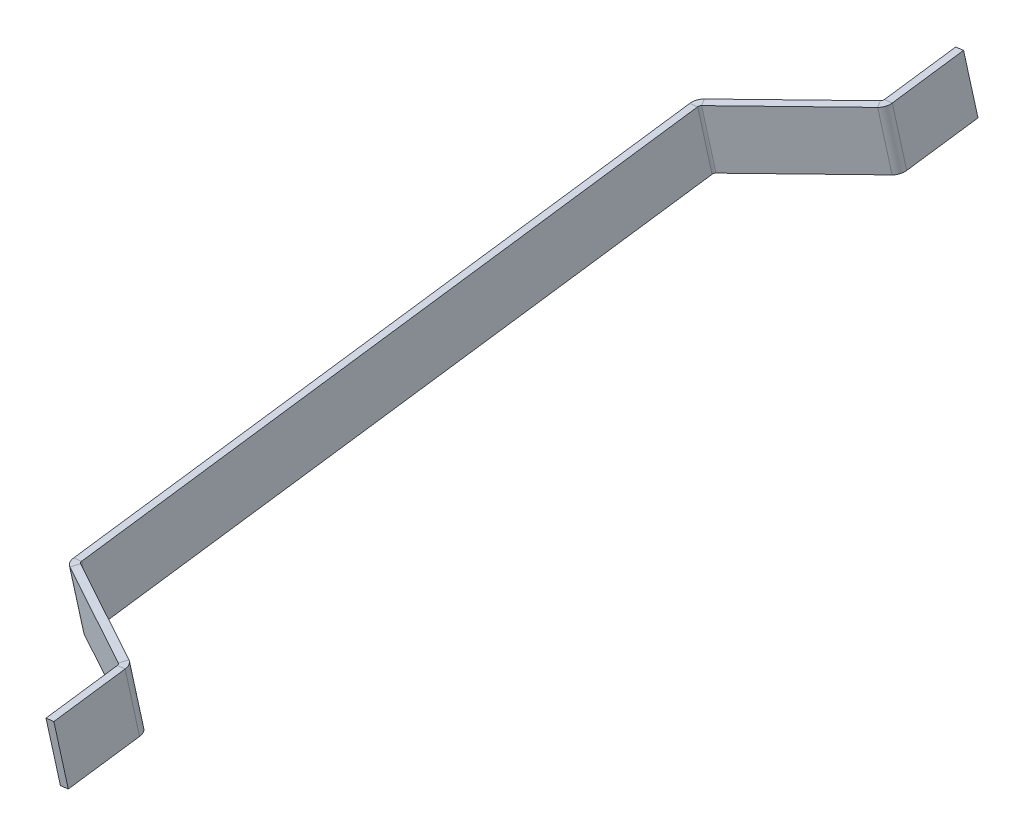
ISO-10303-21;
HEADER;
FILE_DESCRIPTION(('STEP AP214'),'2;1');
FILE_NAME('part.step','',(''),(''),'','','');
FILE_SCHEMA(('AUTOMOTIVE_DESIGN { 1 0 10303 214 1 1 1 1 }'));
ENDSEC;
DATA;
#1=APPLICATION_CONTEXT('core data for automotive mechanical design processes');
#2=APPLICATION_PROTOCOL_DEFINITION('international standard','automotive_design',2000,#1);
#3=PRODUCT_CONTEXT('',#1,'mechanical');
#4=PRODUCT('Part','Part','',(#3));
#5=PRODUCT_RELATED_PRODUCT_CATEGORY('part','',(#4));
#6=PRODUCT_DEFINITION_FORMATION('','',#4);
#7=PRODUCT_DEFINITION_CONTEXT('part definition',#1,'design');
#8=PRODUCT_DEFINITION('design','',#6,#7);
#9=PRODUCT_DEFINITION_SHAPE('','',#8);
#10=(LENGTH_UNIT() NAMED_UNIT(*) SI_UNIT(.MILLI.,.METRE.));
#11=(NAMED_UNIT(*) PLANE_ANGLE_UNIT() SI_UNIT($,.RADIAN.));
#12=(NAMED_UNIT(*) SI_UNIT($,.STERADIAN.) SOLID_ANGLE_UNIT());
#13=UNCERTAINTY_MEASURE_WITH_UNIT(LENGTH_MEASURE(1.E-05),#10,'distance_accuracy_value','');
#14=(GEOMETRIC_REPRESENTATION_CONTEXT(3) GLOBAL_UNCERTAINTY_ASSIGNED_CONTEXT((#13)) GLOBAL_UNIT_ASSIGNED_CONTEXT((#10,
#11,#12)) REPRESENTATION_CONTEXT('',''));
#15=CARTESIAN_POINT('',(0.,0.,0.));
#16=DIRECTION('',(0.,0.,1.));
#17=DIRECTION('',(1.,0.,0.));
#18=AXIS2_PLACEMENT_3D('',#15,#16,#17);
#19=CARTESIAN_POINT('',(82.6834600041197,-26.7837866283072,175.494995340924));
#20=DIRECTION('',(-0.120960947799844,0.985147863137996,0.121869343405159));
#21=DIRECTION('',(0.,-0.122770816771276,0.992435049033091));
#22=AXIS2_PLACEMENT_3D('',#19,#20,#21);
#23=PLANE('',#22);
#24=DIRECTION('',(0.483410747997688,0.165689925363093,-0.859570181749861));
#25=VECTOR('',#24,1.);
#26=CARTESIAN_POINT('',(82.3147471262454,-26.8029502008679,175.283942208965));
#27=LINE('',#26,#25);
#28=CARTESIAN_POINT('',(82.3147471262454,-26.8029502008679,175.283942208965));
#29=VERTEX_POINT('',#28);
#30=CARTESIAN_POINT('',(83.2815686222408,-26.4715703501417,173.564801845465));
#31=VERTEX_POINT('',#30);
#32=EDGE_CURVE('E235',#29,#31,#27,.T.);
#33=ORIENTED_EDGE('',*,*,#32,.F.);
#34=DIRECTION('',(0.866996250180865,0.0450614734314727,0.496273075820665));
#35=VECTOR('',#34,1.);
#36=CARTESIAN_POINT('',(82.6834600041197,-26.7837866283072,175.494995340924));
#37=LINE('',#36,#35);
#38=CARTESIAN_POINT('',(53.7084251625204,-28.2897421182166,158.909537606993));
#39=VERTEX_POINT('',#38);
#40=EDGE_CURVE('E250',#39,#29,#37,.T.);
#41=ORIENTED_EDGE('',*,*,#40,.F.);
#42=DIRECTION('',(-0.483410747997686,-0.165689925363088,0.859570181749863));
#43=VECTOR('',#42,1.);
#44=CARTESIAN_POINT('',(54.6752466585158,-27.9583622674904,157.190397243493));
#45=LINE('',#44,#43);
#46=CARTESIAN_POINT('',(54.6752466585158,-27.9583622674904,157.190397243493));
#47=VERTEX_POINT('',#46);
#48=EDGE_CURVE('E241',#47,#39,#45,.T.);
#49=ORIENTED_EDGE('',*,*,#48,.F.);
#50=DIRECTION('',(0.866996250180865,0.0450614734314727,0.496273075820665));
#51=VECTOR('',#50,1.);
#52=CARTESIAN_POINT('',(83.6502815001151,-26.452406777581,173.775854977424));
#53=LINE('',#52,#51);
#54=EDGE_CURVE('E249',#47,#31,#53,.T.);
#55=ORIENTED_EDGE('',*,*,#54,.T.);
#56=EDGE_LOOP('',(#33,#41,#49,#55));
#57=FACE_BOUND('',#56,.T.);
#58=ADVANCED_FACE('F39',(#57),#23,.F.);
#59=CARTESIAN_POINT('',(51.5252980676484,-13.5316877437073,160.526524626111));
#60=DIRECTION('',(0.120960947799844,-0.985147863137996,-0.121869343405159));
#61=DIRECTION('',(0.,0.122770816771276,-0.992435049033091));
#62=AXIS2_PLACEMENT_3D('',#59,#60,#61);
#63=PLANE('',#62);
#64=DIRECTION('',(0.483410747997681,0.165689925363098,-0.859570181749864));
#65=VECTOR('',#64,1.);
#66=CARTESIAN_POINT('',(80.5003329092477,-12.025732253798,177.111982360042));
#67=LINE('',#66,#65);
#68=CARTESIAN_POINT('',(80.5003329092477,-12.025732253798,177.111982360042));
#69=VERTEX_POINT('',#68);
#70=CARTESIAN_POINT('',(81.4671544052431,-11.6943524030718,175.392841996542));
#71=VERTEX_POINT('',#70);
#72=EDGE_CURVE('E228',#69,#71,#67,.T.);
#73=ORIENTED_EDGE('',*,*,#72,.T.);
#74=DIRECTION('',(-0.866996250180865,-0.0450614734314726,-0.496273075820664));
#75=VECTOR('',#74,1.);
#76=CARTESIAN_POINT('',(52.4921195636438,-13.2003078929812,158.807384262611));
#77=LINE('',#76,#75);
#78=CARTESIAN_POINT('',(52.8608324415181,-13.1811443204205,159.01843739457));
#79=VERTEX_POINT('',#78);
#80=EDGE_CURVE('E254',#71,#79,#77,.T.);
#81=ORIENTED_EDGE('',*,*,#80,.T.);
#82=DIRECTION('',(-0.483410747997686,-0.165689925363088,0.859570181749863));
#83=VECTOR('',#82,1.);
#84=CARTESIAN_POINT('',(52.8608324415181,-13.1811443204205,159.01843739457));
#85=LINE('',#84,#83);
#86=CARTESIAN_POINT('',(51.8940109455227,-13.5125241711467,160.73757775807));
#87=VERTEX_POINT('',#86);
#88=EDGE_CURVE('E237',#79,#87,#85,.T.);
#89=ORIENTED_EDGE('',*,*,#88,.T.);
#90=DIRECTION('',(-0.866996250180865,-0.0450614734314726,-0.496273075820664));
#91=VECTOR('',#90,1.);
#92=CARTESIAN_POINT('',(51.5252980676484,-13.5316877437073,160.526524626111));
#93=LINE('',#92,#91);
#94=EDGE_CURVE('E253',#69,#87,#93,.T.);
#95=ORIENTED_EDGE('',*,*,#94,.F.);
#96=EDGE_LOOP('',(#73,#81,#89,#95));
#97=FACE_BOUND('',#96,.T.);
#98=ADVANCED_FACE('F464',(#97),#63,.F.);
#99=CARTESIAN_POINT('',(-55.7459584144616,-19.1070300510368,99.1239102659929));
#100=DIRECTION('',(0.483410747997686,0.165689925363088,-0.859570181749863));
#101=DIRECTION('',(-0.871617770538203,0.,-0.490186150438803));
#102=AXIS2_PLACEMENT_3D('',#99,#100,#101);
#103=PLANE('',#102);
#104=DIRECTION('',(-0.120960947799848,0.985147863137994,0.121869343405168));
#105=VECTOR('',#104,1.);
#106=CARTESIAN_POINT('',(80.5003329092477,-12.025732253798,177.111982360042));
#107=LINE('',#106,#105);
#108=EDGE_CURVE('E232',#69,#29,#107,.F.);
#109=ORIENTED_EDGE('',*,*,#108,.F.);
#110=ORIENTED_EDGE('',*,*,#94,.T.);
#111=DIRECTION('',(-0.120960947799846,0.985147863137996,0.121869343405157));
#112=VECTOR('',#111,1.);
#113=CARTESIAN_POINT('',(51.8940109455227,-13.5125241711464,160.73757775807));
#114=LINE('',#113,#112);
#115=EDGE_CURVE('E244',#39,#87,#114,.T.);
#116=ORIENTED_EDGE('',*,*,#115,.F.);
#117=ORIENTED_EDGE('',*,*,#40,.T.);
#118=EDGE_LOOP('',(#109,#110,#116,#117));
#119=FACE_BOUND('',#118,.T.);
#120=ADVANCED_FACE('F470',(#119),#103,.F.);
#121=CARTESIAN_POINT('',(-54.7791369184663,-18.7756502003106,97.4047699024932));
#122=DIRECTION('',(0.483410747997686,0.165689925363088,-0.859570181749863));
#123=DIRECTION('',(-0.871617770538203,0.,-0.490186150438803));
#124=AXIS2_PLACEMENT_3D('',#121,#122,#123);
#125=PLANE('',#124);
#126=ORIENTED_EDGE('',*,*,#80,.F.);
#127=DIRECTION('',(-0.120960947799848,0.985147863137994,0.121869343405168));
#128=VECTOR('',#127,1.);
#129=CARTESIAN_POINT('',(81.4671544052431,-11.6943524030718,175.392841996542));
#130=LINE('',#129,#128);
#131=EDGE_CURVE('E183',#71,#31,#130,.F.);
#132=ORIENTED_EDGE('',*,*,#131,.T.);
#133=ORIENTED_EDGE('',*,*,#54,.F.);
#134=DIRECTION('',(0.120960947799846,-0.985147863137996,-0.121869343405157));
#135=VECTOR('',#134,1.);
#136=CARTESIAN_POINT('',(52.8608324415181,-13.1811443204205,159.01843739457));
#137=LINE('',#136,#135);
#138=EDGE_CURVE('E239',#79,#47,#137,.T.);
#139=ORIENTED_EDGE('',*,*,#138,.F.);
#140=EDGE_LOOP('',(#126,#132,#133,#139));
#141=FACE_BOUND('',#140,.T.);
#142=ADVANCED_FACE('F662',(#141),#125,.T.);
#143=CARTESIAN_POINT('',(50.1157776657231,6.15344375499394,0.));
#144=DIRECTION('',(-0.992546151641321,-0.121869343405158,0.));
#145=DIRECTION('',(0.121869343405158,-0.992546151641321,0.));
#146=AXIS2_PLACEMENT_3D('',#143,#144,#145);
#147=PLANE('',#146);
#148=DIRECTION('',(0.120960947799849,-0.985147863137995,-0.121869343405163));
#149=VECTOR('',#148,1.);
#150=CARTESIAN_POINT('',(54.3002175201919,-27.9260840268202,156.557237847616));
#151=LINE('',#150,#149);
#152=CARTESIAN_POINT('',(54.3002175201919,-27.9260840268202,156.557237847616));
#153=VERTEX_POINT('',#152);
#154=CARTESIAN_POINT('',(52.4858033031942,-13.1488660797503,158.385277998693));
#155=VERTEX_POINT('',#154);
#156=EDGE_CURVE('E273',#153,#155,#151,.F.);
#157=ORIENTED_EDGE('',*,*,#156,.F.);
#158=DIRECTION('',(0.0148521368620045,-0.120960947799844,0.992546151641321));
#159=VECTOR('',#158,1.);
#160=CARTESIAN_POINT('',(51.9301918827207,-8.62377419207598,-1.82804015107737));
#161=LINE('',#160,#159);
#162=CARTESIAN_POINT('',(51.9365081431703,-8.67521600530687,-1.4059338871594));
#163=VERTEX_POINT('',#162);
#164=EDGE_CURVE('E11',#163,#153,#161,.T.);
#165=ORIENTED_EDGE('',*,*,#164,.F.);
#166=DIRECTION('',(-0.120960947799845,0.985147863137996,0.121869343405158));
#167=VECTOR('',#166,1.);
#168=CARTESIAN_POINT('',(50.1220939261727,6.10200194176307,0.422106263917971));
#169=LINE('',#168,#167);
#170=CARTESIAN_POINT('',(50.1220939261727,6.10200194176306,0.422106263917971));
#171=VERTEX_POINT('',#170);
#172=EDGE_CURVE('E368',#171,#163,#169,.F.);
#173=ORIENTED_EDGE('',*,*,#172,.F.);
#174=DIRECTION('',(-0.0148521368620045,0.120960947799844,-0.992546151641321));
#175=VECTOR('',#174,1.);
#176=CARTESIAN_POINT('',(52.4921195636438,-13.2003078929812,158.807384262611));
#177=LINE('',#176,#175);
#178=EDGE_CURVE('E48',#155,#171,#177,.T.);
#179=ORIENTED_EDGE('',*,*,#178,.F.);
#180=EDGE_LOOP('',(#157,#165,#173,#179));
#181=FACE_BOUND('',#180,.T.);
#182=ADVANCED_FACE('F399',(#181),#147,.F.);
#183=CARTESIAN_POINT('',(48.1306853624404,5.90970506818363,0.));
#184=DIRECTION('',(-0.992546151641321,-0.121869343405158,0.));
#185=DIRECTION('',(0.121869343405158,-0.992546151641321,0.));
#186=AXIS2_PLACEMENT_3D('',#183,#184,#185);
#187=PLANE('',#186);
#188=DIRECTION('',(0.0148521368620045,-0.120960947799844,0.992546151641321));
#189=VECTOR('',#188,1.);
#190=CARTESIAN_POINT('',(49.9450995794381,-8.8675128788863,-1.82804015107737));
#191=LINE('',#190,#189);
#192=CARTESIAN_POINT('',(49.9514158398877,-8.91895469211719,-1.4059338871594));
#193=VERTEX_POINT('',#192);
#194=CARTESIAN_POINT('',(52.3151252169093,-28.1698227136305,156.557237847616));
#195=VERTEX_POINT('',#194);
#196=EDGE_CURVE('E43',#193,#195,#191,.T.);
#197=ORIENTED_EDGE('',*,*,#196,.T.);
#198=DIRECTION('',(0.120960947799849,-0.985147863137995,-0.121869343405163));
#199=VECTOR('',#198,1.);
#200=CARTESIAN_POINT('',(52.3151252169093,-28.1698227136305,156.557237847616));
#201=LINE('',#200,#199);
#202=CARTESIAN_POINT('',(50.5007109999115,-13.3926047665606,158.385277998693));
#203=VERTEX_POINT('',#202);
#204=EDGE_CURVE('E260',#195,#203,#201,.F.);
#205=ORIENTED_EDGE('',*,*,#204,.T.);
#206=DIRECTION('',(-0.0148521368620045,0.120960947799844,-0.992546151641321));
#207=VECTOR('',#206,1.);
#208=CARTESIAN_POINT('',(50.5070272603611,-13.4440465797915,158.807384262611));
#209=LINE('',#208,#207);
#210=CARTESIAN_POINT('',(48.13700162289,5.85826325495274,0.422106263917973));
#211=VERTEX_POINT('',#210);
#212=EDGE_CURVE('E375',#203,#211,#209,.T.);
#213=ORIENTED_EDGE('',*,*,#212,.T.);
#214=DIRECTION('',(-0.120960947799845,0.985147863137996,0.121869343405158));
#215=VECTOR('',#214,1.);
#216=CARTESIAN_POINT('',(48.13700162289,5.85826325495275,0.422106263917973));
#217=LINE('',#216,#215);
#218=EDGE_CURVE('E355',#211,#193,#217,.F.);
#219=ORIENTED_EDGE('',*,*,#218,.T.);
#220=EDGE_LOOP('',(#197,#205,#213,#219));
#221=FACE_BOUND('',#220,.T.);
#222=ADVANCED_FACE('F383',(#221),#187,.T.);
#223=CARTESIAN_POINT('',(51.9301918827207,-8.62377419207598,-1.82804015107737));
#224=DIRECTION('',(0.120960947799844,-0.985147863137996,-0.121869343405158));
#225=DIRECTION('',(0.,0.122770816771276,-0.992435049033091));
#226=AXIS2_PLACEMENT_3D('',#223,#224,#225);
#227=PLANE('',#226);
#228=ORIENTED_EDGE('',*,*,#164,.T.);
#229=DIRECTION('',(-0.99254615164132,-0.121869343405162,0.));
#230=VECTOR('',#229,1.);
#231=CARTESIAN_POINT('',(54.3002175201919,-27.9260840268202,156.557237847616));
#232=LINE('',#231,#230);
#233=EDGE_CURVE('E267',#153,#195,#232,.T.);
#234=ORIENTED_EDGE('',*,*,#233,.T.);
#235=ORIENTED_EDGE('',*,*,#196,.F.);
#236=DIRECTION('',(-0.992546151641321,-0.121869343405154,0.));
#237=VECTOR('',#236,1.);
#238=CARTESIAN_POINT('',(51.9365081431703,-8.67521600530687,-1.4059338871594));
#239=LINE('',#238,#237);
#240=EDGE_CURVE('E372',#163,#193,#239,.T.);
#241=ORIENTED_EDGE('',*,*,#240,.F.);
#242=EDGE_LOOP('',(#228,#234,#235,#241));
#243=FACE_BOUND('',#242,.T.);
#244=ADVANCED_FACE('F386',(#243),#227,.T.);
#245=CARTESIAN_POINT('',(79.7529937751676,-2.9170544642428,-20.3436913804671));
#246=DIRECTION('',(0.120960947799844,-0.985147863137996,-0.121869343405158));
#247=DIRECTION('',(0.,0.122770816771276,-0.992435049033091));
#248=AXIS2_PLACEMENT_3D('',#245,#246,#247);
#249=PLANE('',#248);
#250=DIRECTION('',(0.852144113318861,0.166022421231319,-0.496273075820664));
#251=VECTOR('',#250,1.);
#252=CARTESIAN_POINT('',(79.7529937751676,-2.9170544642428,-20.3436913804671));
#253=LINE('',#252,#251);
#254=CARTESIAN_POINT('',(51.2743176928581,-8.46552764236857,-3.75823364653608));
#255=VERTEX_POINT('',#254);
#256=CARTESIAN_POINT('',(79.3905971577429,-2.98765985003436,-20.1326382485081));
#257=VERTEX_POINT('',#256);
#258=EDGE_CURVE('E345',#255,#257,#253,.T.);
#259=ORIENTED_EDGE('',*,*,#258,.T.);
#260=DIRECTION('',(0.509135403643686,-0.0438205819579218,0.859570181749838));
#261=VECTOR('',#260,1.);
#262=CARTESIAN_POINT('',(79.3905971577429,-2.98765985003436,-20.1326382485082));
#263=LINE('',#262,#261);
#264=CARTESIAN_POINT('',(80.4088679650303,-3.0753010139502,-18.4134978850085));
#265=VERTEX_POINT('',#264);
#266=EDGE_CURVE('E319',#257,#265,#263,.T.);
#267=ORIENTED_EDGE('',*,*,#266,.T.);
#268=DIRECTION('',(0.852144113318861,0.166022421231319,-0.496273075820664));
#269=VECTOR('',#268,1.);
#270=CARTESIAN_POINT('',(80.7712645824549,-3.00469562815866,-18.6245510169674));
#271=LINE('',#270,#269);
#272=CARTESIAN_POINT('',(52.2925885001454,-8.55316880628442,-2.03909328303635));
#273=VERTEX_POINT('',#272);
#274=EDGE_CURVE('E344',#273,#265,#271,.T.);
#275=ORIENTED_EDGE('',*,*,#274,.F.);
#276=DIRECTION('',(-0.509135403643643,0.0438205819579288,-0.859570181749863));
#277=VECTOR('',#276,1.);
#278=CARTESIAN_POINT('',(52.2925885001454,-8.55316880628442,-2.03909328303635));
#279=LINE('',#278,#277);
#280=EDGE_CURVE('E331',#273,#255,#279,.T.);
#281=ORIENTED_EDGE('',*,*,#280,.T.);
#282=EDGE_LOOP('',(#259,#267,#275,#281));
#283=FACE_BOUND('',#282,.T.);
#284=ADVANCED_FACE('F418',(#283),#249,.T.);
#285=CARTESIAN_POINT('',(11.8353968274918,-1.01865628076951,19.9816279309649));
#286=DIRECTION('',(-0.509135403643643,0.0438205819579288,-0.859570181749863));
#287=DIRECTION('',(-0.860396664211654,0.,0.509624940729413));
#288=AXIS2_PLACEMENT_3D('',#285,#286,#287);
#289=PLANE('',#288);
#290=DIRECTION('',(-0.852144113318861,-0.166022421231319,0.496273075820664));
#291=VECTOR('',#290,1.);
#292=CARTESIAN_POINT('',(49.0975068584358,6.24108491890981,-1.71914036349972));
#293=LINE('',#292,#291);
#294=CARTESIAN_POINT('',(77.5761829407453,11.7895580970356,-18.3045980974308));
#295=VERTEX_POINT('',#294);
#296=CARTESIAN_POINT('',(49.4599034758605,6.31169030470137,-1.9301934954587));
#297=VERTEX_POINT('',#296);
#298=EDGE_CURVE('E348',#295,#297,#293,.T.);
#299=ORIENTED_EDGE('',*,*,#298,.F.);
#300=DIRECTION('',(0.12096094779984,-0.985147863137996,-0.121869343405157));
#301=VECTOR('',#300,1.);
#302=CARTESIAN_POINT('',(79.3905971577429,-2.98765985003436,-20.1326382485082));
#303=LINE('',#302,#301);
#304=EDGE_CURVE('E325',#257,#295,#303,.F.);
#305=ORIENTED_EDGE('',*,*,#304,.F.);
#306=ORIENTED_EDGE('',*,*,#258,.F.);
#307=DIRECTION('',(-0.120960947799844,0.985147863137996,0.121869343405158));
#308=VECTOR('',#307,1.);
#309=CARTESIAN_POINT('',(49.4599034758605,6.31169030470137,-1.9301934954587));
#310=LINE('',#309,#308);
#311=EDGE_CURVE('E339',#255,#297,#310,.T.);
#312=ORIENTED_EDGE('',*,*,#311,.T.);
#313=EDGE_LOOP('',(#299,#305,#306,#312));
#314=FACE_BOUND('',#313,.T.);
#315=ADVANCED_FACE('F763',(#314),#289,.T.);
#316=CARTESIAN_POINT('',(12.8536676347791,-1.10629744468536,21.7007682944646));
#317=DIRECTION('',(-0.509135403643643,0.0438205819579288,-0.859570181749863));
#318=DIRECTION('',(-0.860396664211654,0.,0.509624940729413));
#319=AXIS2_PLACEMENT_3D('',#316,#317,#318);
#320=PLANE('',#319);
#321=DIRECTION('',(0.12096094779984,-0.985147863137996,-0.121869343405157));
#322=VECTOR('',#321,1.);
#323=CARTESIAN_POINT('',(80.4088679650302,-3.07530101395021,-18.4134978850085));
#324=LINE('',#323,#322);
#325=CARTESIAN_POINT('',(78.5944537480326,11.7019169331197,-16.5854577339311));
#326=VERTEX_POINT('',#325);
#327=EDGE_CURVE('E313',#265,#326,#324,.F.);
#328=ORIENTED_EDGE('',*,*,#327,.T.);
#329=DIRECTION('',(-0.852144113318861,-0.166022421231319,0.496273075820664));
#330=VECTOR('',#329,1.);
#331=CARTESIAN_POINT('',(50.1157776657231,6.15344375499395,0.));
#332=LINE('',#331,#330);
#333=CARTESIAN_POINT('',(50.4781742831477,6.22404914078551,-0.211053131958978));
#334=VERTEX_POINT('',#333);
#335=EDGE_CURVE('E349',#326,#334,#332,.T.);
#336=ORIENTED_EDGE('',*,*,#335,.T.);
#337=DIRECTION('',(-0.120960947799844,0.985147863137996,0.121869343405158));
#338=VECTOR('',#337,1.);
#339=CARTESIAN_POINT('',(52.2925885001454,-8.55316880628442,-2.03909328303635));
#340=LINE('',#339,#338);
#341=EDGE_CURVE('E333',#273,#334,#340,.T.);
#342=ORIENTED_EDGE('',*,*,#341,.F.);
#343=ORIENTED_EDGE('',*,*,#274,.T.);
#344=EDGE_LOOP('',(#328,#336,#342,#343));
#345=FACE_BOUND('',#344,.T.);
#346=ADVANCED_FACE('F415',(#345),#320,.F.);
#347=CARTESIAN_POINT('',(52.4921195636438,-13.2003078929812,158.807384262611));
#348=DIRECTION('',(-0.120960947799844,0.985147863137996,0.121869343405158));
#349=DIRECTION('',(0.,-0.122770816771276,0.992435049033091));
#350=AXIS2_PLACEMENT_3D('',#347,#348,#349);
#351=PLANE('',#350);
#352=DIRECTION('',(-0.99254615164132,-0.121869343405163,0.));
#353=VECTOR('',#352,1.);
#354=CARTESIAN_POINT('',(52.4858033031942,-13.1488660797503,158.385277998693));
#355=LINE('',#354,#353);
#356=EDGE_CURVE('E277',#155,#203,#355,.T.);
#357=ORIENTED_EDGE('',*,*,#356,.F.);
#358=ORIENTED_EDGE('',*,*,#178,.T.);
#359=DIRECTION('',(-0.992546151641321,-0.121869343405159,0.));
#360=VECTOR('',#359,1.);
#361=CARTESIAN_POINT('',(50.1220939261727,6.10200194176306,0.422106263917971));
#362=LINE('',#361,#360);
#363=EDGE_CURVE('E362',#171,#211,#362,.T.);
#364=ORIENTED_EDGE('',*,*,#363,.T.);
#365=ORIENTED_EDGE('',*,*,#212,.F.);
#366=EDGE_LOOP('',(#357,#358,#364,#365));
#367=FACE_BOUND('',#366,.T.);
#368=ADVANCED_FACE('F41',(#367),#351,.T.);
#369=CARTESIAN_POINT('',(52.6676176384693,-8.58544704695463,-1.4059338871594));
#370=DIRECTION('',(0.120960947799845,-0.985147863137996,-0.121869343405158));
#371=DIRECTION('',(0.,0.122770816771276,-0.992435049033091));
#372=AXIS2_PLACEMENT_3D('',#369,#370,#371);
#373=PLANE('',#372);
#374=ORIENTED_EDGE('',*,*,#280,.F.);
#375=CARTESIAN_POINT('',(52.6676176384693,-8.58544704695463,-1.4059338871594));
#376=DIRECTION('',(-0.120960947799845,0.985147863137996,0.121869343405158));
#377=DIRECTION('',(0.,-0.122770816771276,0.992435049033091));
#378=AXIS2_PLACEMENT_3D('',#375,#376,#377);
#379=CIRCLE('',#378,0.736599999999999);
#380=EDGE_CURVE('E365',#163,#273,#379,.F.);
#381=ORIENTED_EDGE('',*,*,#380,.F.);
#382=ORIENTED_EDGE('',*,*,#240,.T.);
#383=CARTESIAN_POINT('',(52.6676176384693,-8.58544704695463,-1.4059338871594));
#384=DIRECTION('',(-0.120960947799845,0.985147863137996,0.121869343405158));
#385=DIRECTION('',(0.,-0.122770816771276,0.992435049033091));
#386=AXIS2_PLACEMENT_3D('',#383,#384,#385);
#387=CIRCLE('',#386,2.7366);
#388=EDGE_CURVE('E358',#193,#255,#387,.F.);
#389=ORIENTED_EDGE('',*,*,#388,.T.);
#390=EDGE_LOOP('',(#374,#381,#382,#389));
#391=FACE_BOUND('',#390,.T.);
#392=ADVANCED_FACE('F816',(#391),#373,.T.);
#393=CARTESIAN_POINT('',(50.8532034214716,6.1917709001153,0.42210626391797));
#394=DIRECTION('',(0.120960947799845,-0.985147863137996,-0.121869343405158));
#395=DIRECTION('',(0.,0.122770816771276,-0.992435049033091));
#396=AXIS2_PLACEMENT_3D('',#393,#394,#395);
#397=PLANE('',#396);
#398=CARTESIAN_POINT('',(50.8532034214716,6.1917709001153,0.42210626391797));
#399=DIRECTION('',(-0.120960947799845,0.985147863137996,0.121869343405158));
#400=DIRECTION('',(0.,-0.122770816771276,0.992435049033091));
#401=AXIS2_PLACEMENT_3D('',#398,#399,#400);
#402=CIRCLE('',#401,0.736599999999999);
#403=EDGE_CURVE('E351',#334,#171,#402,.T.);
#404=ORIENTED_EDGE('',*,*,#403,.F.);
#405=DIRECTION('',(-0.509135403643643,0.0438205819579288,-0.859570181749863));
#406=VECTOR('',#405,1.);
#407=CARTESIAN_POINT('',(50.4781742831478,6.22404914078551,-0.211053131958975));
#408=LINE('',#407,#406);
#409=EDGE_CURVE('E336',#334,#297,#408,.T.);
#410=ORIENTED_EDGE('',*,*,#409,.T.);
#411=CARTESIAN_POINT('',(50.8532034214716,6.1917709001153,0.42210626391797));
#412=DIRECTION('',(-0.120960947799845,0.985147863137996,0.121869343405158));
#413=DIRECTION('',(0.,-0.122770816771276,0.992435049033091));
#414=AXIS2_PLACEMENT_3D('',#411,#412,#413);
#415=CIRCLE('',#414,2.7366);
#416=EDGE_CURVE('E359',#297,#211,#415,.T.);
#417=ORIENTED_EDGE('',*,*,#416,.T.);
#418=ORIENTED_EDGE('',*,*,#363,.F.);
#419=EDGE_LOOP('',(#404,#410,#417,#418));
#420=FACE_BOUND('',#419,.T.);
#421=ADVANCED_FACE('F406',(#420),#397,.F.);
#422=CARTESIAN_POINT('',(50.8532034214716,6.1917709001153,0.422106263917971));
#423=DIRECTION('',(-0.120960947799845,0.985147863137996,0.121869343405158));
#424=DIRECTION('',(-0.509135403643643,0.0438205819579283,-0.859570181749863));
#425=AXIS2_PLACEMENT_3D('',#422,#423,#424);
#426=CYLINDRICAL_SURFACE('',#425,2.7366);
#427=ORIENTED_EDGE('',*,*,#218,.F.);
#428=ORIENTED_EDGE('',*,*,#416,.F.);
#429=ORIENTED_EDGE('',*,*,#311,.F.);
#430=ORIENTED_EDGE('',*,*,#388,.F.);
#431=EDGE_LOOP('',(#427,#428,#429,#430));
#432=FACE_BOUND('',#431,.T.);
#433=ADVANCED_FACE('F796',(#432),#426,.T.);
#434=CARTESIAN_POINT('',(50.8532034214716,6.1917709001153,0.422106263917971));
#435=DIRECTION('',(-0.120960947799845,0.985147863137996,0.121869343405158));
#436=DIRECTION('',(-0.509135403643643,0.0438205819579283,-0.859570181749863));
#437=AXIS2_PLACEMENT_3D('',#434,#435,#436);
#438=CYLINDRICAL_SURFACE('',#437,0.736599999999999);
#439=ORIENTED_EDGE('',*,*,#172,.T.);
#440=ORIENTED_EDGE('',*,*,#380,.T.);
#441=ORIENTED_EDGE('',*,*,#341,.T.);
#442=ORIENTED_EDGE('',*,*,#403,.T.);
#443=EDGE_LOOP('',(#439,#440,#441,#442));
#444=FACE_BOUND('',#443,.T.);
#445=ADVANCED_FACE('F410',(#444),#438,.F.);
#446=CARTESIAN_POINT('',(49.0975068584358,6.24108491890981,-1.71914036349972));
#447=DIRECTION('',(-0.120960947799844,0.985147863137996,0.121869343405158));
#448=DIRECTION('',(0.,-0.122770816771276,0.992435049033091));
#449=AXIS2_PLACEMENT_3D('',#446,#447,#448);
#450=PLANE('',#449);
#451=DIRECTION('',(0.509135403643678,-0.0438205819579253,0.859570181749843));
#452=VECTOR('',#451,1.);
#453=CARTESIAN_POINT('',(77.5761829407453,11.7895580970356,-18.3045980974308));
#454=LINE('',#453,#452);
#455=EDGE_CURVE('E64',#295,#326,#454,.T.);
#456=ORIENTED_EDGE('',*,*,#455,.F.);
#457=ORIENTED_EDGE('',*,*,#298,.T.);
#458=ORIENTED_EDGE('',*,*,#409,.F.);
#459=ORIENTED_EDGE('',*,*,#335,.F.);
#460=EDGE_LOOP('',(#456,#457,#458,#459));
#461=FACE_BOUND('',#460,.T.);
#462=ADVANCED_FACE('F454',(#461),#450,.T.);
#463=CARTESIAN_POINT('',(77.2011538024214,11.8218363377058,-18.9377574933077));
#464=DIRECTION('',(-0.12096094779984,0.985147863137996,0.121869343405157));
#465=DIRECTION('',(0.,-0.122770816771275,0.992435049033091));
#466=AXIS2_PLACEMENT_3D('',#463,#464,#465);
#467=PLANE('',#466);
#468=DIRECTION('',(0.992546151641321,0.121869343405159,0.));
#469=VECTOR('',#468,1.);
#470=CARTESIAN_POINT('',(77.9322632977203,11.911605296058,-18.9377574933077));
#471=LINE('',#470,#469);
#472=CARTESIAN_POINT('',(77.9322632977203,11.911605296058,-18.9377574933077));
#473=VERTEX_POINT('',#472);
#474=CARTESIAN_POINT('',(79.917355601003,12.1553439828683,-18.9377574933077));
#475=VERTEX_POINT('',#474);
#476=EDGE_CURVE('E280',#473,#475,#471,.T.);
#477=ORIENTED_EDGE('',*,*,#476,.F.);
#478=CARTESIAN_POINT('',(77.2011538024214,11.8218363377058,-18.9377574933077));
#479=DIRECTION('',(0.12096094779984,-0.985147863137996,-0.121869343405157));
#480=DIRECTION('',(0.,0.122770816771275,-0.992435049033091));
#481=AXIS2_PLACEMENT_3D('',#478,#479,#480);
#482=CIRCLE('',#481,0.736599999999965);
#483=EDGE_CURVE('E322',#295,#473,#482,.F.);
#484=ORIENTED_EDGE('',*,*,#483,.F.);
#485=ORIENTED_EDGE('',*,*,#455,.T.);
#486=CARTESIAN_POINT('',(77.2011538024214,11.8218363377058,-18.9377574933077));
#487=DIRECTION('',(0.12096094779984,-0.985147863137996,-0.121869343405157));
#488=DIRECTION('',(0.,0.122770816771275,-0.992435049033091));
#489=AXIS2_PLACEMENT_3D('',#486,#487,#488);
#490=CIRCLE('',#489,2.73659999999997);
#491=EDGE_CURVE('E315',#326,#475,#490,.F.);
#492=ORIENTED_EDGE('',*,*,#491,.T.);
#493=EDGE_LOOP('',(#477,#484,#485,#492));
#494=FACE_BOUND('',#493,.T.);
#495=ADVANCED_FACE('F452',(#494),#467,.T.);
#496=CARTESIAN_POINT('',(79.015568019419,-2.95538160936415,-20.7657976443851));
#497=DIRECTION('',(-0.12096094779984,0.985147863137996,0.121869343405157));
#498=DIRECTION('',(0.,-0.122770816771275,0.992435049033091));
#499=AXIS2_PLACEMENT_3D('',#496,#497,#498);
#500=PLANE('',#499);
#501=CARTESIAN_POINT('',(79.015568019419,-2.95538160936415,-20.7657976443851));
#502=DIRECTION('',(0.12096094779984,-0.985147863137996,-0.121869343405157));
#503=DIRECTION('',(0.,0.122770816771275,-0.992435049033091));
#504=AXIS2_PLACEMENT_3D('',#501,#502,#503);
#505=CIRCLE('',#504,0.736599999999965);
#506=CARTESIAN_POINT('',(79.7466775147179,-2.86561265101192,-20.7657976443851));
#507=VERTEX_POINT('',#506);
#508=EDGE_CURVE('E312',#507,#257,#505,.T.);
#509=ORIENTED_EDGE('',*,*,#508,.F.);
#510=DIRECTION('',(0.992546151641321,0.121869343405159,0.));
#511=VECTOR('',#510,1.);
#512=CARTESIAN_POINT('',(79.746677514718,-2.86561265101192,-20.7657976443851));
#513=LINE('',#512,#511);
#514=CARTESIAN_POINT('',(81.7317698180006,-2.6218739642016,-20.7657976443851));
#515=VERTEX_POINT('',#514);
#516=EDGE_CURVE('E285',#507,#515,#513,.T.);
#517=ORIENTED_EDGE('',*,*,#516,.T.);
#518=CARTESIAN_POINT('',(79.015568019419,-2.95538160936416,-20.7657976443851));
#519=DIRECTION('',(0.12096094779984,-0.985147863137996,-0.121869343405157));
#520=DIRECTION('',(0.,0.122770816771275,-0.992435049033091));
#521=AXIS2_PLACEMENT_3D('',#518,#519,#520);
#522=CIRCLE('',#521,2.73659999999997);
#523=EDGE_CURVE('E316',#515,#265,#522,.T.);
#524=ORIENTED_EDGE('',*,*,#523,.T.);
#525=ORIENTED_EDGE('',*,*,#266,.F.);
#526=EDGE_LOOP('',(#509,#517,#524,#525));
#527=FACE_BOUND('',#526,.T.);
#528=ADVANCED_FACE('F423',(#527),#500,.F.);
#529=CARTESIAN_POINT('',(79.015568019419,-2.95538160936416,-20.7657976443851));
#530=DIRECTION('',(0.12096094779984,-0.985147863137996,-0.121869343405157));
#531=DIRECTION('',(0.992546151641321,0.121869343405154,0.));
#532=AXIS2_PLACEMENT_3D('',#529,#530,#531);
#533=CYLINDRICAL_SURFACE('',#532,2.73659999999997);
#534=ORIENTED_EDGE('',*,*,#327,.F.);
#535=ORIENTED_EDGE('',*,*,#523,.F.);
#536=DIRECTION('',(-0.120960947799845,0.985147863137996,0.121869343405157));
#537=VECTOR('',#536,1.);
#538=CARTESIAN_POINT('',(79.917355601003,12.1553439828683,-18.9377574933077));
#539=LINE('',#538,#537);
#540=EDGE_CURVE('E288',#515,#475,#539,.T.);
#541=ORIENTED_EDGE('',*,*,#540,.T.);
#542=ORIENTED_EDGE('',*,*,#491,.F.);
#543=EDGE_LOOP('',(#534,#535,#541,#542));
#544=FACE_BOUND('',#543,.T.);
#545=ADVANCED_FACE('F450',(#544),#533,.T.);
#546=CARTESIAN_POINT('',(79.015568019419,-2.95538160936416,-20.7657976443851));
#547=DIRECTION('',(0.12096094779984,-0.985147863137996,-0.121869343405157));
#548=DIRECTION('',(0.992546151641321,0.121869343405154,0.));
#549=AXIS2_PLACEMENT_3D('',#546,#547,#548);
#550=CYLINDRICAL_SURFACE('',#549,0.736599999999965);
#551=ORIENTED_EDGE('',*,*,#304,.T.);
#552=ORIENTED_EDGE('',*,*,#483,.T.);
#553=DIRECTION('',(0.120960947799844,-0.985147863137996,-0.121869343405157));
#554=VECTOR('',#553,1.);
#555=CARTESIAN_POINT('',(77.9322632977203,11.911605296058,-18.9377574933077));
#556=LINE('',#555,#554);
#557=EDGE_CURVE('E283',#473,#507,#556,.T.);
#558=ORIENTED_EDGE('',*,*,#557,.T.);
#559=ORIENTED_EDGE('',*,*,#508,.T.);
#560=EDGE_LOOP('',(#551,#552,#558,#559));
#561=FACE_BOUND('',#560,.T.);
#562=ADVANCED_FACE('F426',(#561),#550,.F.);
#563=CARTESIAN_POINT('',(81.4581931116408,-0.393770492982908,-39.048520837627));
#564=DIRECTION('',(-0.120960947799845,0.985147863137995,0.12186934340516));
#565=DIRECTION('',(0.,-0.122770816771278,0.992435049033091));
#566=AXIS2_PLACEMENT_3D('',#563,#564,#565);
#567=PLANE('',#566);
#568=ORIENTED_EDGE('',*,*,#516,.F.);
#569=DIRECTION('',(-0.0148521368620047,0.120960947799846,-0.992546151641321));
#570=VECTOR('',#569,1.);
#571=CARTESIAN_POINT('',(79.4731008083581,-0.637509179793225,-39.048520837627));
#572=LINE('',#571,#570);
#573=CARTESIAN_POINT('',(79.4731008083581,-0.637509179793225,-39.048520837627));
#574=VERTEX_POINT('',#573);
#575=EDGE_CURVE('E292',#507,#574,#572,.T.);
#576=ORIENTED_EDGE('',*,*,#575,.T.);
#577=DIRECTION('',(-0.992546151641321,-0.121869343405158,0.));
#578=VECTOR('',#577,1.);
#579=CARTESIAN_POINT('',(81.4581931116408,-0.393770492982908,-39.048520837627));
#580=LINE('',#579,#578);
#581=CARTESIAN_POINT('',(81.4581931116408,-0.393770492982908,-39.048520837627));
#582=VERTEX_POINT('',#581);
#583=EDGE_CURVE('E309',#582,#574,#580,.T.);
#584=ORIENTED_EDGE('',*,*,#583,.F.);
#585=DIRECTION('',(-0.0148521368620047,0.120960947799846,-0.992546151641321));
#586=VECTOR('',#585,1.);
#587=CARTESIAN_POINT('',(81.4581931116408,-0.393770492982908,-39.048520837627));
#588=LINE('',#587,#586);
#589=EDGE_CURVE('E293',#515,#582,#588,.T.);
#590=ORIENTED_EDGE('',*,*,#589,.F.);
#591=EDGE_LOOP('',(#568,#576,#584,#590));
#592=FACE_BOUND('',#591,.T.);
#593=ADVANCED_FACE('F444',(#592),#567,.F.);
#594=CARTESIAN_POINT('',(79.9236718614526,12.1039021696375,-18.5156512293897));
#595=DIRECTION('',(0.120960947799845,-0.985147863137995,-0.12186934340516));
#596=DIRECTION('',(0.,0.122770816771277,-0.992435049033091));
#597=AXIS2_PLACEMENT_3D('',#594,#595,#596);
#598=PLANE('',#597);
#599=ORIENTED_EDGE('',*,*,#476,.T.);
#600=DIRECTION('',(0.0148521368620047,-0.120960947799846,0.992546151641321));
#601=VECTOR('',#600,1.);
#602=CARTESIAN_POINT('',(79.9236718614526,12.1039021696375,-18.5156512293897));
#603=LINE('',#602,#601);
#604=CARTESIAN_POINT('',(79.6437788946431,14.383447454087,-37.2204806865497));
#605=VERTEX_POINT('',#604);
#606=EDGE_CURVE('E298',#605,#475,#603,.T.);
#607=ORIENTED_EDGE('',*,*,#606,.F.);
#608=DIRECTION('',(-0.992546151641321,-0.121869343405158,0.));
#609=VECTOR('',#608,1.);
#610=CARTESIAN_POINT('',(79.6437788946431,14.383447454087,-37.2204806865497));
#611=LINE('',#610,#609);
#612=CARTESIAN_POINT('',(77.6586865913605,14.1397087672767,-37.2204806865497));
#613=VERTEX_POINT('',#612);
#614=EDGE_CURVE('E301',#605,#613,#611,.T.);
#615=ORIENTED_EDGE('',*,*,#614,.T.);
#616=DIRECTION('',(0.0148521368620047,-0.120960947799846,0.992546151641321));
#617=VECTOR('',#616,1.);
#618=CARTESIAN_POINT('',(77.9385795581699,11.8601634828271,-18.5156512293897));
#619=LINE('',#618,#617);
#620=EDGE_CURVE('E296',#613,#473,#619,.T.);
#621=ORIENTED_EDGE('',*,*,#620,.T.);
#622=EDGE_LOOP('',(#599,#607,#615,#621));
#623=FACE_BOUND('',#622,.T.);
#624=ADVANCED_FACE('F435',(#623),#598,.F.);
#625=CARTESIAN_POINT('',(80.2007340269683,9.84741191159285,0.));
#626=DIRECTION('',(-0.992546151641321,-0.121869343405159,0.));
#627=DIRECTION('',(0.121869343405159,-0.992546151641321,0.));
#628=AXIS2_PLACEMENT_3D('',#625,#626,#627);
#629=PLANE('',#628);
#630=ORIENTED_EDGE('',*,*,#540,.F.);
#631=ORIENTED_EDGE('',*,*,#589,.T.);
#632=DIRECTION('',(-0.120960947799845,0.985147863137996,0.121869343405158));
#633=VECTOR('',#632,1.);
#634=CARTESIAN_POINT('',(79.6437788946431,14.383447454087,-37.2204806865497));
#635=LINE('',#634,#633);
#636=EDGE_CURVE('E295',#582,#605,#635,.T.);
#637=ORIENTED_EDGE('',*,*,#636,.T.);
#638=ORIENTED_EDGE('',*,*,#606,.T.);
#639=EDGE_LOOP('',(#630,#631,#637,#638));
#640=FACE_BOUND('',#639,.T.);
#641=ADVANCED_FACE('F447',(#640),#629,.F.);
#642=CARTESIAN_POINT('',(78.2156417236856,9.60367322478253,0.));
#643=DIRECTION('',(-0.992546151641321,-0.121869343405159,0.));
#644=DIRECTION('',(0.121869343405159,-0.992546151641321,0.));
#645=AXIS2_PLACEMENT_3D('',#642,#643,#644);
#646=PLANE('',#645);
#647=ORIENTED_EDGE('',*,*,#575,.F.);
#648=ORIENTED_EDGE('',*,*,#557,.F.);
#649=ORIENTED_EDGE('',*,*,#620,.F.);
#650=DIRECTION('',(-0.120960947799845,0.985147863137996,0.121869343405158));
#651=VECTOR('',#650,1.);
#652=CARTESIAN_POINT('',(77.6586865913605,14.1397087672767,-37.2204806865497));
#653=LINE('',#652,#651);
#654=EDGE_CURVE('E303',#574,#613,#653,.T.);
#655=ORIENTED_EDGE('',*,*,#654,.F.);
#656=EDGE_LOOP('',(#647,#648,#649,#655));
#657=FACE_BOUND('',#656,.T.);
#658=ADVANCED_FACE('F432',(#657),#646,.T.);
#659=CARTESIAN_POINT('',(79.6437788946431,14.383447454087,-37.2204806865497));
#660=DIRECTION('',(0.0148521368620044,-0.120960947799845,0.992546151641321));
#661=DIRECTION('',(0.,-0.992655640632956,-0.120974291151365));
#662=AXIS2_PLACEMENT_3D('',#659,#660,#661);
#663=PLANE('',#662);
#664=ORIENTED_EDGE('',*,*,#654,.T.);
#665=ORIENTED_EDGE('',*,*,#614,.F.);
#666=ORIENTED_EDGE('',*,*,#636,.F.);
#667=ORIENTED_EDGE('',*,*,#583,.T.);
#668=EDGE_LOOP('',(#664,#665,#666,#667));
#669=FACE_BOUND('',#668,.T.);
#670=ADVANCED_FACE('F440',(#669),#663,.F.);
#671=CARTESIAN_POINT('',(53.2169127984931,-13.059097121398,158.385277998693));
#672=DIRECTION('',(-0.120960947799849,0.985147863137995,0.121869343405163));
#673=DIRECTION('',(0.,-0.12277081677128,0.99243504903309));
#674=AXIS2_PLACEMENT_3D('',#671,#672,#673);
#675=PLANE('',#674);
#676=ORIENTED_EDGE('',*,*,#88,.F.);
#677=CARTESIAN_POINT('',(53.2169127984931,-13.059097121398,158.385277998693));
#678=DIRECTION('',(0.120960947799849,-0.985147863137995,-0.121869343405163));
#679=DIRECTION('',(0.,0.12277081677128,-0.99243504903309));
#680=AXIS2_PLACEMENT_3D('',#677,#678,#679);
#681=CIRCLE('',#680,0.736599999999935);
#682=EDGE_CURVE('E270',#155,#79,#681,.F.);
#683=ORIENTED_EDGE('',*,*,#682,.F.);
#684=ORIENTED_EDGE('',*,*,#356,.T.);
#685=CARTESIAN_POINT('',(53.2169127984931,-13.059097121398,158.385277998693));
#686=DIRECTION('',(0.120960947799849,-0.985147863137995,-0.121869343405163));
#687=DIRECTION('',(0.,0.12277081677128,-0.99243504903309));
#688=AXIS2_PLACEMENT_3D('',#685,#686,#687);
#689=CIRCLE('',#688,2.73659999999993);
#690=EDGE_CURVE('E263',#203,#87,#689,.F.);
#691=ORIENTED_EDGE('',*,*,#690,.T.);
#692=EDGE_LOOP('',(#676,#683,#684,#691));
#693=FACE_BOUND('',#692,.T.);
#694=ADVANCED_FACE('F483',(#693),#675,.T.);
#695=CARTESIAN_POINT('',(55.0313270154909,-27.836315068468,156.557237847616));
#696=DIRECTION('',(-0.120960947799849,0.985147863137995,0.121869343405163));
#697=DIRECTION('',(0.,-0.12277081677128,0.99243504903309));
#698=AXIS2_PLACEMENT_3D('',#695,#696,#697);
#699=PLANE('',#698);
#700=CARTESIAN_POINT('',(55.0313270154909,-27.836315068468,156.557237847616));
#701=DIRECTION('',(0.120960947799849,-0.985147863137995,-0.121869343405163));
#702=DIRECTION('',(0.,0.12277081677128,-0.99243504903309));
#703=AXIS2_PLACEMENT_3D('',#700,#701,#702);
#704=CIRCLE('',#703,0.736599999999935);
#705=EDGE_CURVE('E256',#47,#153,#704,.T.);
#706=ORIENTED_EDGE('',*,*,#705,.F.);
#707=ORIENTED_EDGE('',*,*,#48,.T.);
#708=CARTESIAN_POINT('',(55.0313270154909,-27.836315068468,156.557237847616));
#709=DIRECTION('',(0.120960947799849,-0.985147863137995,-0.121869343405163));
#710=DIRECTION('',(0.,0.12277081677128,-0.99243504903309));
#711=AXIS2_PLACEMENT_3D('',#708,#709,#710);
#712=CIRCLE('',#711,2.73659999999993);
#713=EDGE_CURVE('E264',#39,#195,#712,.T.);
#714=ORIENTED_EDGE('',*,*,#713,.T.);
#715=ORIENTED_EDGE('',*,*,#233,.F.);
#716=EDGE_LOOP('',(#706,#707,#714,#715));
#717=FACE_BOUND('',#716,.T.);
#718=ADVANCED_FACE('F390',(#717),#699,.F.);
#719=CARTESIAN_POINT('',(55.0313270154909,-27.836315068468,156.557237847616));
#720=DIRECTION('',(0.120960947799849,-0.985147863137995,-0.121869343405163));
#721=DIRECTION('',(-0.483410747997685,-0.165689925363094,0.859570181749862));
#722=AXIS2_PLACEMENT_3D('',#719,#720,#721);
#723=CYLINDRICAL_SURFACE('',#722,2.73659999999993);
#724=ORIENTED_EDGE('',*,*,#204,.F.);
#725=ORIENTED_EDGE('',*,*,#713,.F.);
#726=ORIENTED_EDGE('',*,*,#115,.T.);
#727=ORIENTED_EDGE('',*,*,#690,.F.);
#728=EDGE_LOOP('',(#724,#725,#726,#727));
#729=FACE_BOUND('',#728,.T.);
#730=ADVANCED_FACE('F476',(#729),#723,.T.);
#731=CARTESIAN_POINT('',(55.0313270154909,-27.836315068468,156.557237847616));
#732=DIRECTION('',(0.120960947799849,-0.985147863137995,-0.121869343405163));
#733=DIRECTION('',(-0.483410747997685,-0.165689925363094,0.859570181749862));
#734=AXIS2_PLACEMENT_3D('',#731,#732,#733);
#735=CYLINDRICAL_SURFACE('',#734,0.736599999999935);
#736=ORIENTED_EDGE('',*,*,#156,.T.);
#737=ORIENTED_EDGE('',*,*,#682,.T.);
#738=ORIENTED_EDGE('',*,*,#138,.T.);
#739=ORIENTED_EDGE('',*,*,#705,.T.);
#740=EDGE_LOOP('',(#736,#737,#738,#739));
#741=FACE_BOUND('',#740,.T.);
#742=ADVANCED_FACE('F394',(#741),#735,.F.);
#743=CARTESIAN_POINT('',(81.9586667692704,-26.9249973998903,175.917101604842));
#744=DIRECTION('',(0.120960947799848,-0.985147863137994,-0.121869343405168));
#745=DIRECTION('',(0.,0.122770816771286,-0.99243504903309));
#746=AXIS2_PLACEMENT_3D('',#743,#744,#745);
#747=PLANE('',#746);
#748=DIRECTION('',(0.992546151641321,0.121869343405158,0.));
#749=VECTOR('',#748,1.);
#750=CARTESIAN_POINT('',(82.6897762645693,-26.8352284415381,175.917101604842));
#751=LINE('',#750,#749);
#752=CARTESIAN_POINT('',(82.6897762645693,-26.8352284415381,175.917101604842));
#753=VERTEX_POINT('',#752);
#754=CARTESIAN_POINT('',(84.674868567852,-26.5914897547278,175.917101604842));
#755=VERTEX_POINT('',#754);
#756=EDGE_CURVE('E869',#753,#755,#751,.T.);
#757=ORIENTED_EDGE('',*,*,#756,.F.);
#758=CARTESIAN_POINT('',(81.9586667692704,-26.9249973998903,175.917101604842));
#759=DIRECTION('',(-0.120960947799848,0.985147863137994,0.121869343405168));
#760=DIRECTION('',(0.,-0.122770816771286,0.99243504903309));
#761=AXIS2_PLACEMENT_3D('',#758,#759,#760);
#762=CIRCLE('',#761,0.736599999999964);
#763=EDGE_CURVE('E186',#29,#753,#762,.F.);
#764=ORIENTED_EDGE('',*,*,#763,.F.);
#765=ORIENTED_EDGE('',*,*,#32,.T.);
#766=CARTESIAN_POINT('',(81.9586667692704,-26.9249973998903,175.917101604842));
#767=DIRECTION('',(-0.120960947799848,0.985147863137994,0.121869343405168));
#768=DIRECTION('',(0.,-0.122770816771286,0.99243504903309));
#769=AXIS2_PLACEMENT_3D('',#766,#767,#768);
#770=CIRCLE('',#769,2.73659999999996);
#771=EDGE_CURVE('E56',#31,#755,#770,.F.);
#772=ORIENTED_EDGE('',*,*,#771,.T.);
#773=EDGE_LOOP('',(#757,#764,#765,#772));
#774=FACE_BOUND('',#773,.T.);
#775=ADVANCED_FACE('F482',(#774),#747,.T.);
#776=CARTESIAN_POINT('',(80.1442525522726,-12.1477794528204,177.745141755919));
#777=DIRECTION('',(0.120960947799848,-0.985147863137994,-0.121869343405168));
#778=DIRECTION('',(0.,0.122770816771286,-0.99243504903309));
#779=AXIS2_PLACEMENT_3D('',#776,#777,#778);
#780=PLANE('',#779);
#781=CARTESIAN_POINT('',(80.1442525522726,-12.1477794528204,177.745141755919));
#782=DIRECTION('',(-0.120960947799848,0.985147863137994,0.121869343405168));
#783=DIRECTION('',(0.,-0.122770816771286,0.99243504903309));
#784=AXIS2_PLACEMENT_3D('',#781,#782,#783);
#785=CIRCLE('',#784,0.736599999999964);
#786=CARTESIAN_POINT('',(80.8753620475716,-12.0580104944682,177.745141755919));
#787=VERTEX_POINT('',#786);
#788=EDGE_CURVE('E193',#787,#69,#785,.T.);
#789=ORIENTED_EDGE('',*,*,#788,.F.);
#790=DIRECTION('',(0.992546151641321,0.121869343405158,0.));
#791=VECTOR('',#790,1.);
#792=CARTESIAN_POINT('',(80.8753620475717,-12.0580104944682,177.745141755919));
#793=LINE('',#792,#791);
#794=CARTESIAN_POINT('',(82.8604543508543,-11.8142718076578,177.745141755919));
#795=VERTEX_POINT('',#794);
#796=EDGE_CURVE('E190',#787,#795,#793,.T.);
#797=ORIENTED_EDGE('',*,*,#796,.T.);
#798=CARTESIAN_POINT('',(80.1442525522726,-12.1477794528204,177.745141755919));
#799=DIRECTION('',(-0.120960947799848,0.985147863137994,0.121869343405168));
#800=DIRECTION('',(0.,-0.122770816771286,0.99243504903309));
#801=AXIS2_PLACEMENT_3D('',#798,#799,#800);
#802=CIRCLE('',#801,2.73659999999996);
#803=EDGE_CURVE('E177',#795,#71,#802,.T.);
#804=ORIENTED_EDGE('',*,*,#803,.T.);
#805=ORIENTED_EDGE('',*,*,#72,.F.);
#806=EDGE_LOOP('',(#789,#797,#804,#805));
#807=FACE_BOUND('',#806,.T.);
#808=ADVANCED_FACE('F191',(#807),#780,.F.);
#809=CARTESIAN_POINT('',(80.1442525522726,-12.1477794528204,177.745141755919));
#810=DIRECTION('',(-0.120960947799848,0.985147863137994,0.121869343405168));
#811=DIRECTION('',(0.99254615164132,0.121869343405162,0.));
#812=AXIS2_PLACEMENT_3D('',#809,#810,#811);
#813=CYLINDRICAL_SURFACE('',#812,2.73659999999996);
#814=ORIENTED_EDGE('',*,*,#131,.F.);
#815=ORIENTED_EDGE('',*,*,#803,.F.);
#816=DIRECTION('',(0.120960947799844,-0.985147863137996,-0.12186934340516));
#817=VECTOR('',#816,1.);
#818=CARTESIAN_POINT('',(82.8604543508543,-11.8142718076582,177.745141755919));
#819=LINE('',#818,#817);
#820=EDGE_CURVE('E181',#795,#755,#819,.T.);
#821=ORIENTED_EDGE('',*,*,#820,.T.);
#822=ORIENTED_EDGE('',*,*,#771,.F.);
#823=EDGE_LOOP('',(#814,#815,#821,#822));
#824=FACE_BOUND('',#823,.T.);
#825=ADVANCED_FACE('F179',(#824),#813,.T.);
#826=CARTESIAN_POINT('',(80.1442525522726,-12.1477794528204,177.745141755919));
#827=DIRECTION('',(-0.120960947799848,0.985147863137994,0.121869343405168));
#828=DIRECTION('',(0.99254615164132,0.121869343405162,0.));
#829=AXIS2_PLACEMENT_3D('',#826,#827,#828);
#830=CYLINDRICAL_SURFACE('',#829,0.736599999999964);
#831=ORIENTED_EDGE('',*,*,#108,.T.);
#832=ORIENTED_EDGE('',*,*,#763,.T.);
#833=DIRECTION('',(-0.120960947799845,0.985147863137995,0.12186934340516));
#834=VECTOR('',#833,1.);
#835=CARTESIAN_POINT('',(82.6897762645693,-26.8352284415381,175.917101604842));
#836=LINE('',#835,#834);
#837=EDGE_CURVE('E197',#753,#787,#836,.T.);
#838=ORIENTED_EDGE('',*,*,#837,.T.);
#839=ORIENTED_EDGE('',*,*,#788,.T.);
#840=EDGE_LOOP('',(#831,#832,#838,#839));
#841=FACE_BOUND('',#840,.T.);
#842=ADVANCED_FACE('F563',(#841),#830,.F.);
#843=CARTESIAN_POINT('',(84.6685523074024,-26.5400479414969,175.494995340924));
#844=DIRECTION('',(-0.120960947799844,0.985147863137995,0.12186934340516));
#845=DIRECTION('',(0.,-0.122770816771278,0.992435049033091));
#846=AXIS2_PLACEMENT_3D('',#843,#844,#845);
#847=PLANE('',#846);
#848=ORIENTED_EDGE('',*,*,#756,.T.);
#849=DIRECTION('',(-0.014852136862004,0.120960947799847,-0.99254615164132));
#850=VECTOR('',#849,1.);
#851=CARTESIAN_POINT('',(84.6685523074024,-26.5400479414969,175.494995340924));
#852=LINE('',#851,#850);
#853=CARTESIAN_POINT('',(84.9484452742118,-28.8195932259465,194.199824798084));
#854=VERTEX_POINT('',#853);
#855=EDGE_CURVE('E205',#854,#755,#852,.T.);
#856=ORIENTED_EDGE('',*,*,#855,.F.);
#857=DIRECTION('',(-0.992546151641321,-0.121869343405158,0.));
#858=VECTOR('',#857,1.);
#859=CARTESIAN_POINT('',(84.9484452742118,-28.8195932259465,194.199824798084));
#860=LINE('',#859,#858);
#861=CARTESIAN_POINT('',(82.9633529709292,-29.0633319127568,194.199824798084));
#862=VERTEX_POINT('',#861);
#863=EDGE_CURVE('E214',#854,#862,#860,.T.);
#864=ORIENTED_EDGE('',*,*,#863,.T.);
#865=DIRECTION('',(-0.014852136862004,0.120960947799847,-0.99254615164132));
#866=VECTOR('',#865,1.);
#867=CARTESIAN_POINT('',(82.6834600041197,-26.7837866283072,175.494995340924));
#868=LINE('',#867,#866);
#869=EDGE_CURVE('E206',#862,#753,#868,.T.);
#870=ORIENTED_EDGE('',*,*,#869,.T.);
#871=EDGE_LOOP('',(#848,#856,#864,#870));
#872=FACE_BOUND('',#871,.T.);
#873=ADVANCED_FACE('F570',(#872),#847,.F.);
#874=CARTESIAN_POINT('',(83.1340310572141,-14.0423752788766,196.027864949161));
#875=DIRECTION('',(0.120960947799844,-0.985147863137995,-0.12186934340516));
#876=DIRECTION('',(0.,0.122770816771278,-0.992435049033091));
#877=AXIS2_PLACEMENT_3D('',#874,#875,#876);
#878=PLANE('',#877);
#879=ORIENTED_EDGE('',*,*,#796,.F.);
#880=DIRECTION('',(0.014852136862004,-0.120960947799847,0.99254615164132));
#881=VECTOR('',#880,1.);
#882=CARTESIAN_POINT('',(81.1489387539315,-14.2861139656869,196.027864949161));
#883=LINE('',#882,#881);
#884=CARTESIAN_POINT('',(81.1489387539315,-14.2861139656869,196.027864949161));
#885=VERTEX_POINT('',#884);
#886=EDGE_CURVE('E221',#787,#885,#883,.T.);
#887=ORIENTED_EDGE('',*,*,#886,.T.);
#888=DIRECTION('',(-0.992546151641321,-0.121869343405158,0.));
#889=VECTOR('',#888,1.);
#890=CARTESIAN_POINT('',(83.1340310572141,-14.0423752788766,196.027864949161));
#891=LINE('',#890,#889);
#892=CARTESIAN_POINT('',(83.1340310572141,-14.0423752788766,196.027864949161));
#893=VERTEX_POINT('',#892);
#894=EDGE_CURVE('E210',#893,#885,#891,.T.);
#895=ORIENTED_EDGE('',*,*,#894,.F.);
#896=DIRECTION('',(0.014852136862004,-0.120960947799847,0.99254615164132));
#897=VECTOR('',#896,1.);
#898=CARTESIAN_POINT('',(83.1340310572141,-14.0423752788766,196.027864949161));
#899=LINE('',#898,#897);
#900=EDGE_CURVE('E202',#795,#893,#899,.T.);
#901=ORIENTED_EDGE('',*,*,#900,.F.);
#902=EDGE_LOOP('',(#879,#887,#895,#901));
#903=FACE_BOUND('',#902,.T.);
#904=ADVANCED_FACE('F208',(#903),#878,.F.);
#905=CARTESIAN_POINT('',(80.2007340269684,9.84741191159278,0.));
#906=DIRECTION('',(-0.992546151641321,-0.121869343405158,0.));
#907=DIRECTION('',(0.121869343405158,-0.992546151641321,0.));
#908=AXIS2_PLACEMENT_3D('',#905,#906,#907);
#909=PLANE('',#908);
#910=ORIENTED_EDGE('',*,*,#820,.F.);
#911=ORIENTED_EDGE('',*,*,#900,.T.);
#912=DIRECTION('',(0.120960947799844,-0.985147863137996,-0.121869343405158));
#913=VECTOR('',#912,1.);
#914=CARTESIAN_POINT('',(84.9484452742118,-28.8195932259465,194.199824798084));
#915=LINE('',#914,#913);
#916=EDGE_CURVE('E212',#893,#854,#915,.T.);
#917=ORIENTED_EDGE('',*,*,#916,.T.);
#918=ORIENTED_EDGE('',*,*,#855,.T.);
#919=EDGE_LOOP('',(#910,#911,#917,#918));
#920=FACE_BOUND('',#919,.T.);
#921=ADVANCED_FACE('F201',(#920),#909,.F.);
#922=CARTESIAN_POINT('',(78.2156417236857,9.60367322478247,0.));
#923=DIRECTION('',(-0.992546151641321,-0.121869343405158,0.));
#924=DIRECTION('',(0.121869343405158,-0.992546151641321,0.));
#925=AXIS2_PLACEMENT_3D('',#922,#923,#924);
#926=PLANE('',#925);
#927=ORIENTED_EDGE('',*,*,#886,.F.);
#928=ORIENTED_EDGE('',*,*,#837,.F.);
#929=ORIENTED_EDGE('',*,*,#869,.F.);
#930=DIRECTION('',(0.120960947799844,-0.985147863137996,-0.121869343405158));
#931=VECTOR('',#930,1.);
#932=CARTESIAN_POINT('',(82.9633529709292,-29.0633319127568,194.199824798084));
#933=LINE('',#932,#931);
#934=EDGE_CURVE('E216',#885,#862,#933,.T.);
#935=ORIENTED_EDGE('',*,*,#934,.F.);
#936=EDGE_LOOP('',(#927,#928,#929,#935));
#937=FACE_BOUND('',#936,.T.);
#938=ADVANCED_FACE('F591',(#937),#926,.T.);
#939=CARTESIAN_POINT('',(84.9484452742118,-28.8195932259465,194.199824798084));
#940=DIRECTION('',(-0.0148521368620039,0.120960947799845,-0.992546151641321));
#941=DIRECTION('',(0.,0.992655640632956,0.120974291151365));
#942=AXIS2_PLACEMENT_3D('',#939,#940,#941);
#943=PLANE('',#942);
#944=ORIENTED_EDGE('',*,*,#934,.T.);
#945=ORIENTED_EDGE('',*,*,#863,.F.);
#946=ORIENTED_EDGE('',*,*,#916,.F.);
#947=ORIENTED_EDGE('',*,*,#894,.T.);
#948=EDGE_LOOP('',(#944,#945,#946,#947));
#949=FACE_BOUND('',#948,.T.);
#950=ADVANCED_FACE('F598',(#949),#943,.F.);
#951=CLOSED_SHELL('',(#58,#98,#120,#142,#182,#222,#244,#284,#315,#346,#368,#392,#421,#433,#445,
#462,#495,#528,#545,#562,#593,#624,#641,#658,#670,#694,#718,#730,#742,#775,#808,#825,#842,#873,
#904,#921,#938,#950));
#952=MANIFOLD_SOLID_BREP('B2',#951);
#953=ADVANCED_BREP_SHAPE_REPRESENTATION('',(#18,#952),#14);
#954=SHAPE_DEFINITION_REPRESENTATION(#9,#953);
ENDSEC;
END-ISO-10303-21;
